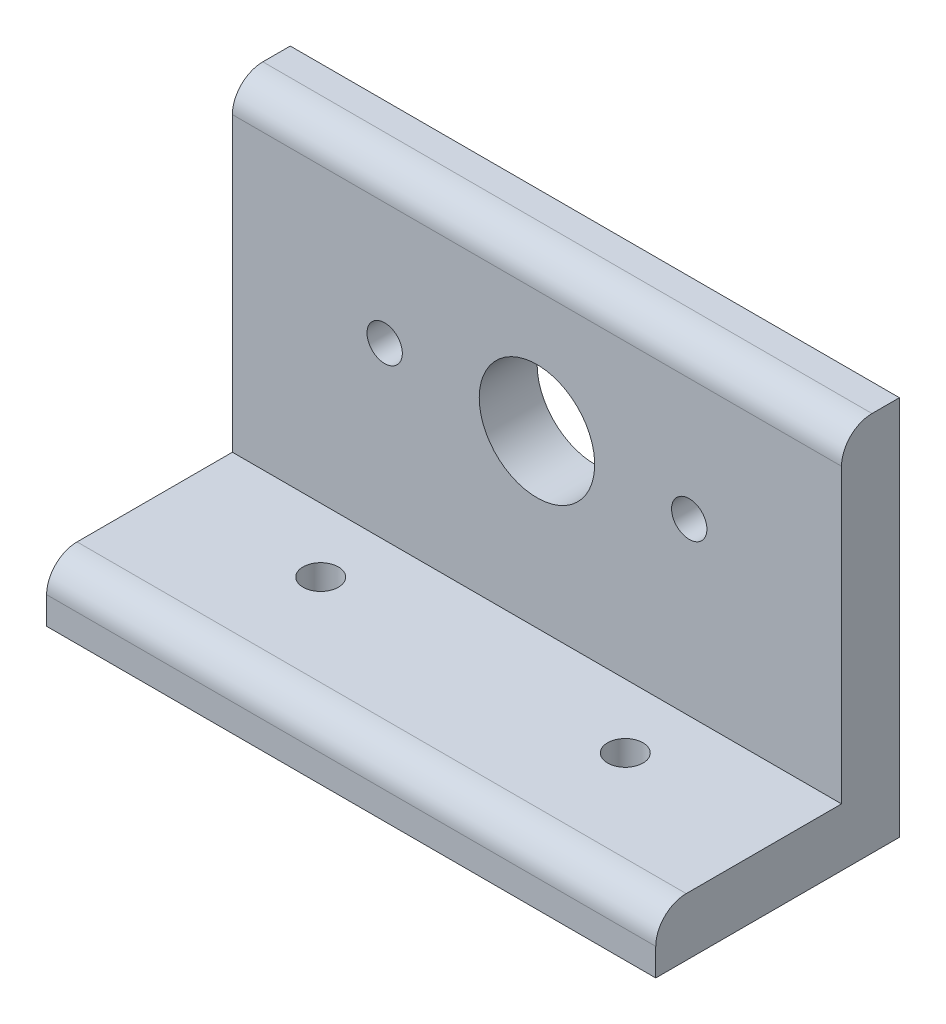
ISO-10303-21;
HEADER;
FILE_DESCRIPTION(('STEP AP214'),'2;1');
FILE_NAME('part.step','',(''),(''),'','','');
FILE_SCHEMA(('AUTOMOTIVE_DESIGN { 1 0 10303 214 1 1 1 1 }'));
ENDSEC;
DATA;
#1=APPLICATION_CONTEXT('core data for automotive mechanical design processes');
#2=APPLICATION_PROTOCOL_DEFINITION('international standard','automotive_design',2000,#1);
#3=PRODUCT_CONTEXT('',#1,'mechanical');
#4=PRODUCT('Part','Part','',(#3));
#5=PRODUCT_RELATED_PRODUCT_CATEGORY('part','',(#4));
#6=PRODUCT_DEFINITION_FORMATION('','',#4);
#7=PRODUCT_DEFINITION_CONTEXT('part definition',#1,'design');
#8=PRODUCT_DEFINITION('design','',#6,#7);
#9=PRODUCT_DEFINITION_SHAPE('','',#8);
#10=(LENGTH_UNIT() NAMED_UNIT(*) SI_UNIT(.MILLI.,.METRE.));
#11=(NAMED_UNIT(*) PLANE_ANGLE_UNIT() SI_UNIT($,.RADIAN.));
#12=(NAMED_UNIT(*) SI_UNIT($,.STERADIAN.) SOLID_ANGLE_UNIT());
#13=UNCERTAINTY_MEASURE_WITH_UNIT(LENGTH_MEASURE(1.E-05),#10,'distance_accuracy_value','');
#14=(GEOMETRIC_REPRESENTATION_CONTEXT(3) GLOBAL_UNCERTAINTY_ASSIGNED_CONTEXT((#13)) GLOBAL_UNIT_ASSIGNED_CONTEXT((#10,
#11,#12)) REPRESENTATION_CONTEXT('',''));
#15=CARTESIAN_POINT('',(0.,0.,0.));
#16=DIRECTION('',(0.,0.,1.));
#17=DIRECTION('',(1.,0.,0.));
#18=AXIS2_PLACEMENT_3D('',#15,#16,#17);
#19=CARTESIAN_POINT('',(0.,4.826,0.));
#20=DIRECTION('',(0.,-1.,0.));
#21=DIRECTION('',(0.,0.,-1.));
#22=AXIS2_PLACEMENT_3D('',#19,#20,#21);
#23=PLANE('',#22);
#24=CARTESIAN_POINT('',(38.1,4.826,-10.16));
#25=DIRECTION('',(0.,1.,0.));
#26=DIRECTION('',(0.,0.,1.));
#27=AXIS2_PLACEMENT_3D('',#24,#25,#26);
#28=CIRCLE('',#27,1.4732);
#29=CARTESIAN_POINT('',(38.1,4.826,-8.6868));
#30=VERTEX_POINT('',#29);
#31=EDGE_CURVE('E144',#30,#30,#28,.T.);
#32=ORIENTED_EDGE('',*,*,#31,.F.);
#33=EDGE_LOOP('',(#32));
#34=FACE_BOUND('',#33,.T.);
#35=CARTESIAN_POINT('',(12.7,4.826,-10.16));
#36=DIRECTION('',(0.,1.,0.));
#37=DIRECTION('',(0.,0.,1.));
#38=AXIS2_PLACEMENT_3D('',#35,#36,#37);
#39=CIRCLE('',#38,1.4732);
#40=CARTESIAN_POINT('',(12.7,4.826,-8.6868));
#41=VERTEX_POINT('',#40);
#42=EDGE_CURVE('E150',#41,#41,#39,.T.);
#43=ORIENTED_EDGE('',*,*,#42,.F.);
#44=EDGE_LOOP('',(#43));
#45=FACE_BOUND('',#44,.T.);
#46=DIRECTION('',(0.,0.,1.));
#47=VECTOR('',#46,1.);
#48=CARTESIAN_POINT('',(0.,4.826,0.));
#49=LINE('',#48,#47);
#50=CARTESIAN_POINT('',(0.,4.826,-15.494));
#51=VERTEX_POINT('',#50);
#52=CARTESIAN_POINT('',(0.,4.826,-2.54));
#53=VERTEX_POINT('',#52);
#54=EDGE_CURVE('E156',#51,#53,#49,.T.);
#55=ORIENTED_EDGE('',*,*,#54,.T.);
#56=DIRECTION('',(1.,0.,0.));
#57=VECTOR('',#56,1.);
#58=CARTESIAN_POINT('',(0.,4.826,-2.54));
#59=LINE('',#58,#57);
#60=CARTESIAN_POINT('',(50.8,4.826,-2.54));
#61=VERTEX_POINT('',#60);
#62=EDGE_CURVE('E174',#53,#61,#59,.T.);
#63=ORIENTED_EDGE('',*,*,#62,.T.);
#64=DIRECTION('',(0.,0.,-1.));
#65=VECTOR('',#64,1.);
#66=CARTESIAN_POINT('',(50.8,4.826,0.));
#67=LINE('',#66,#65);
#68=CARTESIAN_POINT('',(50.8,4.826,-15.494));
#69=VERTEX_POINT('',#68);
#70=EDGE_CURVE('E159',#61,#69,#67,.T.);
#71=ORIENTED_EDGE('',*,*,#70,.T.);
#72=DIRECTION('',(1.,0.,0.));
#73=VECTOR('',#72,1.);
#74=CARTESIAN_POINT('',(0.,4.826,-15.494));
#75=LINE('',#74,#73);
#76=EDGE_CURVE('E139',#51,#69,#75,.T.);
#77=ORIENTED_EDGE('',*,*,#76,.F.);
#78=EDGE_LOOP('',(#55,#63,#71,#77));
#79=FACE_BOUND('',#78,.T.);
#80=ADVANCED_FACE('F43',(#34,#45,#79),#23,.F.);
#81=CARTESIAN_POINT('',(0.,0.,0.));
#82=DIRECTION('',(0.,-1.,0.));
#83=DIRECTION('',(0.,0.,-1.));
#84=AXIS2_PLACEMENT_3D('',#81,#82,#83);
#85=PLANE('',#84);
#86=CARTESIAN_POINT('',(12.7,0.,-10.16));
#87=DIRECTION('',(0.,1.,0.));
#88=DIRECTION('',(0.,0.,1.));
#89=AXIS2_PLACEMENT_3D('',#86,#87,#88);
#90=CIRCLE('',#89,1.4732);
#91=CARTESIAN_POINT('',(12.7,0.,-8.6868));
#92=VERTEX_POINT('',#91);
#93=EDGE_CURVE('E147',#92,#92,#90,.T.);
#94=ORIENTED_EDGE('',*,*,#93,.T.);
#95=EDGE_LOOP('',(#94));
#96=FACE_BOUND('',#95,.T.);
#97=DIRECTION('',(0.,0.,1.));
#98=VECTOR('',#97,1.);
#99=CARTESIAN_POINT('',(0.,0.,0.));
#100=LINE('',#99,#98);
#101=CARTESIAN_POINT('',(0.,0.,-20.32));
#102=VERTEX_POINT('',#101);
#103=CARTESIAN_POINT('',(0.,0.,0.));
#104=VERTEX_POINT('',#103);
#105=EDGE_CURVE('E153',#102,#104,#100,.T.);
#106=ORIENTED_EDGE('',*,*,#105,.F.);
#107=DIRECTION('',(-1.,0.,0.));
#108=VECTOR('',#107,1.);
#109=CARTESIAN_POINT('',(0.,0.,-20.32));
#110=LINE('',#109,#108);
#111=CARTESIAN_POINT('',(50.8,0.,-20.32));
#112=VERTEX_POINT('',#111);
#113=EDGE_CURVE('E160',#112,#102,#110,.T.);
#114=ORIENTED_EDGE('',*,*,#113,.F.);
#115=DIRECTION('',(0.,0.,-1.));
#116=VECTOR('',#115,1.);
#117=CARTESIAN_POINT('',(50.8,0.,0.));
#118=LINE('',#117,#116);
#119=CARTESIAN_POINT('',(50.8,0.,0.));
#120=VERTEX_POINT('',#119);
#121=EDGE_CURVE('E125',#120,#112,#118,.T.);
#122=ORIENTED_EDGE('',*,*,#121,.F.);
#123=DIRECTION('',(1.,0.,0.));
#124=VECTOR('',#123,1.);
#125=CARTESIAN_POINT('',(0.,0.,0.));
#126=LINE('',#125,#124);
#127=EDGE_CURVE('E165',#104,#120,#126,.T.);
#128=ORIENTED_EDGE('',*,*,#127,.F.);
#129=EDGE_LOOP('',(#106,#114,#122,#128));
#130=FACE_BOUND('',#129,.T.);
#131=CARTESIAN_POINT('',(38.1,0.,-10.16));
#132=DIRECTION('',(0.,1.,0.));
#133=DIRECTION('',(0.,0.,1.));
#134=AXIS2_PLACEMENT_3D('',#131,#132,#133);
#135=CIRCLE('',#134,1.4732);
#136=CARTESIAN_POINT('',(38.1,0.,-8.6868));
#137=VERTEX_POINT('',#136);
#138=EDGE_CURVE('E143',#137,#137,#135,.T.);
#139=ORIENTED_EDGE('',*,*,#138,.T.);
#140=EDGE_LOOP('',(#139));
#141=FACE_BOUND('',#140,.T.);
#142=ADVANCED_FACE('F212',(#96,#130,#141),#85,.T.);
#143=CARTESIAN_POINT('',(0.,4.826,0.));
#144=DIRECTION('',(1.,0.,0.));
#145=DIRECTION('',(0.,0.,-1.));
#146=AXIS2_PLACEMENT_3D('',#143,#144,#145);
#147=PLANE('',#146);
#148=DIRECTION('',(0.,-1.,0.));
#149=VECTOR('',#148,1.);
#150=CARTESIAN_POINT('',(0.,4.826,0.));
#151=LINE('',#150,#149);
#152=CARTESIAN_POINT('',(0.,2.286,0.));
#153=VERTEX_POINT('',#152);
#154=EDGE_CURVE('E172',#153,#104,#151,.T.);
#155=ORIENTED_EDGE('',*,*,#154,.F.);
#156=CARTESIAN_POINT('',(0.,2.286,-2.54));
#157=DIRECTION('',(1.,0.,0.));
#158=DIRECTION('',(0.,0.,-1.));
#159=AXIS2_PLACEMENT_3D('',#156,#157,#158);
#160=CIRCLE('',#159,2.54);
#161=EDGE_CURVE('E184',#153,#53,#160,.F.);
#162=ORIENTED_EDGE('',*,*,#161,.T.);
#163=ORIENTED_EDGE('',*,*,#54,.F.);
#164=DIRECTION('',(0.,-1.,0.));
#165=VECTOR('',#164,1.);
#166=CARTESIAN_POINT('',(0.,31.75,-15.494));
#167=LINE('',#166,#165);
#168=CARTESIAN_POINT('',(0.,29.21,-15.494));
#169=VERTEX_POINT('',#168);
#170=EDGE_CURVE('E135',#169,#51,#167,.T.);
#171=ORIENTED_EDGE('',*,*,#170,.F.);
#172=CARTESIAN_POINT('',(0.,29.21,-18.034));
#173=DIRECTION('',(1.,0.,0.));
#174=DIRECTION('',(0.,0.,-1.));
#175=AXIS2_PLACEMENT_3D('',#172,#173,#174);
#176=CIRCLE('',#175,2.54);
#177=CARTESIAN_POINT('',(0.,31.75,-18.034));
#178=VERTEX_POINT('',#177);
#179=EDGE_CURVE('E60',#169,#178,#176,.F.);
#180=ORIENTED_EDGE('',*,*,#179,.T.);
#181=DIRECTION('',(0.,0.,1.));
#182=VECTOR('',#181,1.);
#183=CARTESIAN_POINT('',(0.,31.75,-20.32));
#184=LINE('',#183,#182);
#185=CARTESIAN_POINT('',(0.,31.75,-20.32));
#186=VERTEX_POINT('',#185);
#187=EDGE_CURVE('E118',#186,#178,#184,.T.);
#188=ORIENTED_EDGE('',*,*,#187,.F.);
#189=DIRECTION('',(0.,-1.,0.));
#190=VECTOR('',#189,1.);
#191=CARTESIAN_POINT('',(0.,4.826,-20.32));
#192=LINE('',#191,#190);
#193=EDGE_CURVE('E129',#186,#102,#192,.T.);
#194=ORIENTED_EDGE('',*,*,#193,.T.);
#195=ORIENTED_EDGE('',*,*,#105,.T.);
#196=EDGE_LOOP('',(#155,#162,#163,#171,#180,#188,#194,#195));
#197=FACE_BOUND('',#196,.T.);
#198=ADVANCED_FACE('F220',(#197),#147,.F.);
#199=CARTESIAN_POINT('',(0.,4.826,0.));
#200=DIRECTION('',(0.,0.,-1.));
#201=DIRECTION('',(-1.,0.,0.));
#202=AXIS2_PLACEMENT_3D('',#199,#200,#201);
#203=PLANE('',#202);
#204=DIRECTION('',(0.,-1.,0.));
#205=VECTOR('',#204,1.);
#206=CARTESIAN_POINT('',(50.8,4.826,0.));
#207=LINE('',#206,#205);
#208=CARTESIAN_POINT('',(50.8,2.286,0.));
#209=VERTEX_POINT('',#208);
#210=EDGE_CURVE('E128',#209,#120,#207,.T.);
#211=ORIENTED_EDGE('',*,*,#210,.F.);
#212=DIRECTION('',(1.,0.,0.));
#213=VECTOR('',#212,1.);
#214=CARTESIAN_POINT('',(0.,2.286,0.));
#215=LINE('',#214,#213);
#216=EDGE_CURVE('E181',#209,#153,#215,.F.);
#217=ORIENTED_EDGE('',*,*,#216,.T.);
#218=ORIENTED_EDGE('',*,*,#154,.T.);
#219=ORIENTED_EDGE('',*,*,#127,.T.);
#220=EDGE_LOOP('',(#211,#217,#218,#219));
#221=FACE_BOUND('',#220,.T.);
#222=ADVANCED_FACE('F234',(#221),#203,.F.);
#223=CARTESIAN_POINT('',(50.8,4.826,0.));
#224=DIRECTION('',(-1.,0.,0.));
#225=DIRECTION('',(0.,0.,1.));
#226=AXIS2_PLACEMENT_3D('',#223,#224,#225);
#227=PLANE('',#226);
#228=ORIENTED_EDGE('',*,*,#70,.F.);
#229=CARTESIAN_POINT('',(50.8,2.286,-2.54));
#230=DIRECTION('',(-1.,0.,0.));
#231=DIRECTION('',(0.,0.,1.));
#232=AXIS2_PLACEMENT_3D('',#229,#230,#231);
#233=CIRCLE('',#232,2.54);
#234=EDGE_CURVE('E179',#61,#209,#233,.F.);
#235=ORIENTED_EDGE('',*,*,#234,.T.);
#236=ORIENTED_EDGE('',*,*,#210,.T.);
#237=ORIENTED_EDGE('',*,*,#121,.T.);
#238=DIRECTION('',(0.,-1.,0.));
#239=VECTOR('',#238,1.);
#240=CARTESIAN_POINT('',(50.8,4.826,-20.32));
#241=LINE('',#240,#239);
#242=CARTESIAN_POINT('',(50.8,31.75,-20.32));
#243=VERTEX_POINT('',#242);
#244=EDGE_CURVE('E121',#243,#112,#241,.T.);
#245=ORIENTED_EDGE('',*,*,#244,.F.);
#246=DIRECTION('',(0.,0.,-1.));
#247=VECTOR('',#246,1.);
#248=CARTESIAN_POINT('',(50.8,31.75,-20.32));
#249=LINE('',#248,#247);
#250=CARTESIAN_POINT('',(50.8,31.75,-18.034));
#251=VERTEX_POINT('',#250);
#252=EDGE_CURVE('E111',#251,#243,#249,.T.);
#253=ORIENTED_EDGE('',*,*,#252,.F.);
#254=CARTESIAN_POINT('',(50.8,29.21,-18.034));
#255=DIRECTION('',(-1.,0.,0.));
#256=DIRECTION('',(0.,0.,1.));
#257=AXIS2_PLACEMENT_3D('',#254,#255,#256);
#258=CIRCLE('',#257,2.54);
#259=CARTESIAN_POINT('',(50.8,29.21,-15.494));
#260=VERTEX_POINT('',#259);
#261=EDGE_CURVE('E177',#251,#260,#258,.F.);
#262=ORIENTED_EDGE('',*,*,#261,.T.);
#263=DIRECTION('',(0.,-1.,0.));
#264=VECTOR('',#263,1.);
#265=CARTESIAN_POINT('',(50.8,31.75,-15.494));
#266=LINE('',#265,#264);
#267=EDGE_CURVE('E133',#260,#69,#266,.T.);
#268=ORIENTED_EDGE('',*,*,#267,.T.);
#269=EDGE_LOOP('',(#228,#235,#236,#237,#245,#253,#262,#268));
#270=FACE_BOUND('',#269,.T.);
#271=ADVANCED_FACE('F123',(#270),#227,.F.);
#272=CARTESIAN_POINT('',(0.,4.826,-20.32));
#273=DIRECTION('',(0.,0.,1.));
#274=DIRECTION('',(1.,0.,0.));
#275=AXIS2_PLACEMENT_3D('',#272,#273,#274);
#276=PLANE('',#275);
#277=CARTESIAN_POINT('',(38.1,19.05,-20.32));
#278=DIRECTION('',(0.,0.,-1.));
#279=DIRECTION('',(-1.,0.,0.));
#280=AXIS2_PLACEMENT_3D('',#277,#278,#279);
#281=CIRCLE('',#280,1.4732);
#282=CARTESIAN_POINT('',(36.6268,19.05,-20.32));
#283=VERTEX_POINT('',#282);
#284=EDGE_CURVE('E190',#283,#283,#281,.T.);
#285=ORIENTED_EDGE('',*,*,#284,.F.);
#286=EDGE_LOOP('',(#285));
#287=FACE_BOUND('',#286,.T.);
#288=CARTESIAN_POINT('',(12.7,19.05,-20.32));
#289=DIRECTION('',(0.,0.,-1.));
#290=DIRECTION('',(-1.,0.,0.));
#291=AXIS2_PLACEMENT_3D('',#288,#289,#290);
#292=CIRCLE('',#291,1.4732);
#293=CARTESIAN_POINT('',(11.2268,19.05,-20.32));
#294=VERTEX_POINT('',#293);
#295=EDGE_CURVE('E263',#294,#294,#292,.T.);
#296=ORIENTED_EDGE('',*,*,#295,.F.);
#297=EDGE_LOOP('',(#296));
#298=FACE_BOUND('',#297,.T.);
#299=CARTESIAN_POINT('',(25.4,19.05,-20.32));
#300=DIRECTION('',(0.,0.,-1.));
#301=DIRECTION('',(-1.,0.,0.));
#302=AXIS2_PLACEMENT_3D('',#299,#300,#301);
#303=CIRCLE('',#302,4.8133);
#304=CARTESIAN_POINT('',(20.5867,19.05,-20.32));
#305=VERTEX_POINT('',#304);
#306=EDGE_CURVE('E260',#305,#305,#303,.T.);
#307=ORIENTED_EDGE('',*,*,#306,.F.);
#308=EDGE_LOOP('',(#307));
#309=FACE_BOUND('',#308,.T.);
#310=ORIENTED_EDGE('',*,*,#113,.T.);
#311=ORIENTED_EDGE('',*,*,#193,.F.);
#312=DIRECTION('',(-1.,0.,0.));
#313=VECTOR('',#312,1.);
#314=CARTESIAN_POINT('',(0.,31.75,-20.32));
#315=LINE('',#314,#313);
#316=EDGE_CURVE('E115',#243,#186,#315,.T.);
#317=ORIENTED_EDGE('',*,*,#316,.F.);
#318=ORIENTED_EDGE('',*,*,#244,.T.);
#319=EDGE_LOOP('',(#310,#311,#317,#318));
#320=FACE_BOUND('',#319,.T.);
#321=ADVANCED_FACE('F131',(#287,#298,#309,#320),#276,.F.);
#322=CARTESIAN_POINT('',(12.7,4.826,-10.16));
#323=DIRECTION('',(0.,-1.,0.));
#324=DIRECTION('',(0.,0.,-1.));
#325=AXIS2_PLACEMENT_3D('',#322,#323,#324);
#326=CYLINDRICAL_SURFACE('',#325,1.4732);
#327=ORIENTED_EDGE('',*,*,#42,.T.);
#328=EDGE_LOOP('',(#327));
#329=FACE_BOUND('',#328,.T.);
#330=ORIENTED_EDGE('',*,*,#93,.F.);
#331=EDGE_LOOP('',(#330));
#332=FACE_BOUND('',#331,.T.);
#333=ADVANCED_FACE('F226',(#329,#332),#326,.F.);
#334=CARTESIAN_POINT('',(38.1,4.826,-10.16));
#335=DIRECTION('',(0.,-1.,0.));
#336=DIRECTION('',(0.,0.,-1.));
#337=AXIS2_PLACEMENT_3D('',#334,#335,#336);
#338=CYLINDRICAL_SURFACE('',#337,1.4732);
#339=ORIENTED_EDGE('',*,*,#31,.T.);
#340=EDGE_LOOP('',(#339));
#341=FACE_BOUND('',#340,.T.);
#342=ORIENTED_EDGE('',*,*,#138,.F.);
#343=EDGE_LOOP('',(#342));
#344=FACE_BOUND('',#343,.T.);
#345=ADVANCED_FACE('F278',(#341,#344),#338,.F.);
#346=CARTESIAN_POINT('',(0.,31.75,-15.494));
#347=DIRECTION('',(0.,0.,-1.));
#348=DIRECTION('',(-1.,0.,0.));
#349=AXIS2_PLACEMENT_3D('',#346,#347,#348);
#350=PLANE('',#349);
#351=CARTESIAN_POINT('',(38.1,19.05,-15.494));
#352=DIRECTION('',(0.,0.,-1.));
#353=DIRECTION('',(-1.,0.,0.));
#354=AXIS2_PLACEMENT_3D('',#351,#352,#353);
#355=CIRCLE('',#354,1.4732);
#356=CARTESIAN_POINT('',(36.6268,19.05,-15.494));
#357=VERTEX_POINT('',#356);
#358=EDGE_CURVE('E47',#357,#357,#355,.T.);
#359=ORIENTED_EDGE('',*,*,#358,.T.);
#360=EDGE_LOOP('',(#359));
#361=FACE_BOUND('',#360,.T.);
#362=CARTESIAN_POINT('',(12.7,19.05,-15.494));
#363=DIRECTION('',(0.,0.,-1.));
#364=DIRECTION('',(-1.,0.,0.));
#365=AXIS2_PLACEMENT_3D('',#362,#363,#364);
#366=CIRCLE('',#365,1.4732);
#367=CARTESIAN_POINT('',(11.2268,19.05,-15.494));
#368=VERTEX_POINT('',#367);
#369=EDGE_CURVE('E189',#368,#368,#366,.T.);
#370=ORIENTED_EDGE('',*,*,#369,.T.);
#371=EDGE_LOOP('',(#370));
#372=FACE_BOUND('',#371,.T.);
#373=CARTESIAN_POINT('',(25.4,19.05,-15.494));
#374=DIRECTION('',(0.,0.,-1.));
#375=DIRECTION('',(-1.,0.,0.));
#376=AXIS2_PLACEMENT_3D('',#373,#374,#375);
#377=CIRCLE('',#376,4.8133);
#378=CARTESIAN_POINT('',(20.5867,19.05,-15.494));
#379=VERTEX_POINT('',#378);
#380=EDGE_CURVE('E187',#379,#379,#377,.T.);
#381=ORIENTED_EDGE('',*,*,#380,.T.);
#382=EDGE_LOOP('',(#381));
#383=FACE_BOUND('',#382,.T.);
#384=ORIENTED_EDGE('',*,*,#267,.F.);
#385=DIRECTION('',(1.,0.,0.));
#386=VECTOR('',#385,1.);
#387=CARTESIAN_POINT('',(0.,29.21,-15.494));
#388=LINE('',#387,#386);
#389=EDGE_CURVE('E11',#260,#169,#388,.F.);
#390=ORIENTED_EDGE('',*,*,#389,.T.);
#391=ORIENTED_EDGE('',*,*,#170,.T.);
#392=ORIENTED_EDGE('',*,*,#76,.T.);
#393=EDGE_LOOP('',(#384,#390,#391,#392));
#394=FACE_BOUND('',#393,.T.);
#395=ADVANCED_FACE('F197',(#361,#372,#383,#394),#350,.F.);
#396=CARTESIAN_POINT('',(0.,31.75,0.));
#397=DIRECTION('',(0.,1.,0.));
#398=DIRECTION('',(0.,0.,1.));
#399=AXIS2_PLACEMENT_3D('',#396,#397,#398);
#400=PLANE('',#399);
#401=ORIENTED_EDGE('',*,*,#187,.T.);
#402=DIRECTION('',(1.,0.,0.));
#403=VECTOR('',#402,1.);
#404=CARTESIAN_POINT('',(50.8,31.75,-18.034));
#405=LINE('',#404,#403);
#406=EDGE_CURVE('E52',#178,#251,#405,.T.);
#407=ORIENTED_EDGE('',*,*,#406,.T.);
#408=ORIENTED_EDGE('',*,*,#252,.T.);
#409=ORIENTED_EDGE('',*,*,#316,.T.);
#410=EDGE_LOOP('',(#401,#407,#408,#409));
#411=FACE_BOUND('',#410,.T.);
#412=ADVANCED_FACE('F113',(#411),#400,.T.);
#413=CARTESIAN_POINT('',(0.,2.286,-2.54));
#414=DIRECTION('',(1.,0.,0.));
#415=DIRECTION('',(0.,0.,-1.));
#416=AXIS2_PLACEMENT_3D('',#413,#414,#415);
#417=CYLINDRICAL_SURFACE('',#416,2.54);
#418=ORIENTED_EDGE('',*,*,#161,.F.);
#419=ORIENTED_EDGE('',*,*,#216,.F.);
#420=ORIENTED_EDGE('',*,*,#234,.F.);
#421=ORIENTED_EDGE('',*,*,#62,.F.);
#422=EDGE_LOOP('',(#418,#419,#420,#421));
#423=FACE_BOUND('',#422,.T.);
#424=ADVANCED_FACE('F238',(#423),#417,.T.);
#425=CARTESIAN_POINT('',(0.,29.21,-18.034));
#426=DIRECTION('',(-1.,0.,0.));
#427=DIRECTION('',(0.,0.,1.));
#428=AXIS2_PLACEMENT_3D('',#425,#426,#427);
#429=CYLINDRICAL_SURFACE('',#428,2.54);
#430=ORIENTED_EDGE('',*,*,#179,.F.);
#431=ORIENTED_EDGE('',*,*,#389,.F.);
#432=ORIENTED_EDGE('',*,*,#261,.F.);
#433=ORIENTED_EDGE('',*,*,#406,.F.);
#434=EDGE_LOOP('',(#430,#431,#432,#433));
#435=FACE_BOUND('',#434,.T.);
#436=ADVANCED_FACE('F45',(#435),#429,.T.);
#437=CARTESIAN_POINT('',(25.4,19.05,6.604));
#438=DIRECTION('',(0.,0.,-1.));
#439=DIRECTION('',(-1.,0.,0.));
#440=AXIS2_PLACEMENT_3D('',#437,#438,#439);
#441=CYLINDRICAL_SURFACE('',#440,4.8133);
#442=ORIENTED_EDGE('',*,*,#306,.T.);
#443=EDGE_LOOP('',(#442));
#444=FACE_BOUND('',#443,.T.);
#445=ORIENTED_EDGE('',*,*,#380,.F.);
#446=EDGE_LOOP('',(#445));
#447=FACE_BOUND('',#446,.T.);
#448=ADVANCED_FACE('F207',(#444,#447),#441,.F.);
#449=CARTESIAN_POINT('',(12.7,19.05,6.604));
#450=DIRECTION('',(0.,0.,-1.));
#451=DIRECTION('',(-1.,0.,0.));
#452=AXIS2_PLACEMENT_3D('',#449,#450,#451);
#453=CYLINDRICAL_SURFACE('',#452,1.4732);
#454=ORIENTED_EDGE('',*,*,#295,.T.);
#455=EDGE_LOOP('',(#454));
#456=FACE_BOUND('',#455,.T.);
#457=ORIENTED_EDGE('',*,*,#369,.F.);
#458=EDGE_LOOP('',(#457));
#459=FACE_BOUND('',#458,.T.);
#460=ADVANCED_FACE('F201',(#456,#459),#453,.F.);
#461=CARTESIAN_POINT('',(38.1,19.05,6.604));
#462=DIRECTION('',(0.,0.,-1.));
#463=DIRECTION('',(-1.,0.,0.));
#464=AXIS2_PLACEMENT_3D('',#461,#462,#463);
#465=CYLINDRICAL_SURFACE('',#464,1.4732);
#466=ORIENTED_EDGE('',*,*,#284,.T.);
#467=EDGE_LOOP('',(#466));
#468=FACE_BOUND('',#467,.T.);
#469=ORIENTED_EDGE('',*,*,#358,.F.);
#470=EDGE_LOOP('',(#469));
#471=FACE_BOUND('',#470,.T.);
#472=ADVANCED_FACE('F199',(#468,#471),#465,.F.);
#473=CLOSED_SHELL('',(#80,#142,#198,#222,#271,#321,#333,#345,#395,#412,#424,#436,#448,#460,#472));
#474=MANIFOLD_SOLID_BREP('B2',#473);
#475=ADVANCED_BREP_SHAPE_REPRESENTATION('',(#18,#474),#14);
#476=SHAPE_DEFINITION_REPRESENTATION(#9,#475);
ENDSEC;
END-ISO-10303-21;
